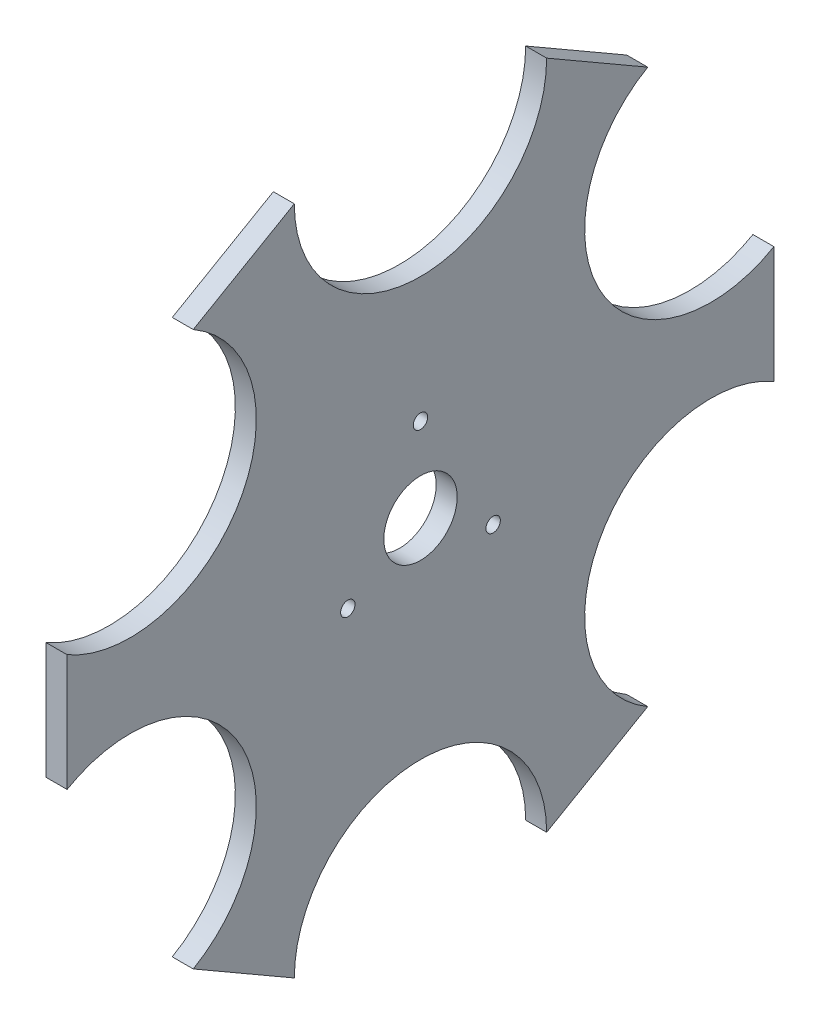
ISO-10303-21;
HEADER;
FILE_DESCRIPTION(('STEP AP214'),'2;1');
FILE_NAME('part.step','',(''),(''),'','','');
FILE_SCHEMA(('AUTOMOTIVE_DESIGN { 1 0 10303 214 1 1 1 1 }'));
ENDSEC;
DATA;
#1=APPLICATION_CONTEXT('core data for automotive mechanical design processes');
#2=APPLICATION_PROTOCOL_DEFINITION('international standard','automotive_design',2000,#1);
#3=PRODUCT_CONTEXT('',#1,'mechanical');
#4=PRODUCT('Part','Part','',(#3));
#5=PRODUCT_RELATED_PRODUCT_CATEGORY('part','',(#4));
#6=PRODUCT_DEFINITION_FORMATION('','',#4);
#7=PRODUCT_DEFINITION_CONTEXT('part definition',#1,'design');
#8=PRODUCT_DEFINITION('design','',#6,#7);
#9=PRODUCT_DEFINITION_SHAPE('','',#8);
#10=(LENGTH_UNIT() NAMED_UNIT(*) SI_UNIT(.MILLI.,.METRE.));
#11=(NAMED_UNIT(*) PLANE_ANGLE_UNIT() SI_UNIT($,.RADIAN.));
#12=(NAMED_UNIT(*) SI_UNIT($,.STERADIAN.) SOLID_ANGLE_UNIT());
#13=UNCERTAINTY_MEASURE_WITH_UNIT(LENGTH_MEASURE(1.E-05),#10,'distance_accuracy_value','');
#14=(GEOMETRIC_REPRESENTATION_CONTEXT(3) GLOBAL_UNCERTAINTY_ASSIGNED_CONTEXT((#13)) GLOBAL_UNIT_ASSIGNED_CONTEXT((#10,
#11,#12)) REPRESENTATION_CONTEXT('',''));
#15=CARTESIAN_POINT('',(0.,0.,0.));
#16=DIRECTION('',(0.,0.,1.));
#17=DIRECTION('',(1.,0.,0.));
#18=AXIS2_PLACEMENT_3D('',#15,#16,#17);
#19=CARTESIAN_POINT('',(6.35,101.5,0.));
#20=DIRECTION('',(1.,0.,0.));
#21=DIRECTION('',(0.,0.,-1.));
#22=AXIS2_PLACEMENT_3D('',#19,#20,#21);
#23=PLANE('',#22);
#24=CARTESIAN_POINT('',(6.35,-12.6999999999998,21.9970452561249));
#25=DIRECTION('',(1.,0.,0.));
#26=DIRECTION('',(0.,0.,-1.));
#27=AXIS2_PLACEMENT_3D('',#24,#25,#26);
#28=CIRCLE('',#27,2.182876);
#29=CARTESIAN_POINT('',(6.35,-12.6999999999998,19.8141692561249));
#30=VERTEX_POINT('',#29);
#31=EDGE_CURVE('E287',#30,#30,#28,.T.);
#32=ORIENTED_EDGE('',*,*,#31,.F.);
#33=EDGE_LOOP('',(#32));
#34=FACE_BOUND('',#33,.T.);
#35=CARTESIAN_POINT('',(6.35,-12.7000000000001,-21.9970452561247));
#36=DIRECTION('',(1.,0.,0.));
#37=DIRECTION('',(0.,0.,-1.));
#38=AXIS2_PLACEMENT_3D('',#35,#36,#37);
#39=CIRCLE('',#38,2.182876);
#40=CARTESIAN_POINT('',(6.35,-12.7000000000001,-24.1799212561247));
#41=VERTEX_POINT('',#40);
#42=EDGE_CURVE('E289',#41,#41,#39,.T.);
#43=ORIENTED_EDGE('',*,*,#42,.F.);
#44=EDGE_LOOP('',(#43));
#45=FACE_BOUND('',#44,.T.);
#46=CARTESIAN_POINT('',(6.35,25.4,0.));
#47=DIRECTION('',(1.,0.,0.));
#48=DIRECTION('',(0.,0.,-1.));
#49=AXIS2_PLACEMENT_3D('',#46,#47,#48);
#50=CIRCLE('',#49,2.182876);
#51=CARTESIAN_POINT('',(6.35,25.4,-2.182876));
#52=VERTEX_POINT('',#51);
#53=EDGE_CURVE('E297',#52,#52,#50,.T.);
#54=ORIENTED_EDGE('',*,*,#53,.F.);
#55=EDGE_LOOP('',(#54));
#56=FACE_BOUND('',#55,.T.);
#57=CARTESIAN_POINT('',(6.35,101.5,0.));
#58=DIRECTION('',(-1.,0.,0.));
#59=DIRECTION('',(0.,0.,-1.));
#60=AXIS2_PLACEMENT_3D('',#57,#58,#59);
#61=CIRCLE('',#60,38.200000054);
#62=CARTESIAN_POINT('',(6.35,101.5,-38.200000054));
#63=VERTEX_POINT('',#62);
#64=CARTESIAN_POINT('',(6.35,101.5,38.200000054));
#65=VERTEX_POINT('',#64);
#66=EDGE_CURVE('E179',#63,#65,#61,.T.);
#67=ORIENTED_EDGE('',*,*,#66,.T.);
#68=DIRECTION('',(0.,-0.5,0.866025403784438));
#69=VECTOR('',#68,1.);
#70=CARTESIAN_POINT('',(6.35,83.8321704713309,68.8015784571206));
#71=LINE('',#70,#69);
#72=CARTESIAN_POINT('',(6.35,83.8321704713308,68.8015784571206));
#73=VERTEX_POINT('',#72);
#74=EDGE_CURVE('E107',#65,#73,#71,.T.);
#75=ORIENTED_EDGE('',*,*,#74,.T.);
#76=CARTESIAN_POINT('',(6.35,50.7499999999999,87.9015784841206));
#77=DIRECTION('',(-1.,0.,0.));
#78=DIRECTION('',(0.,0.,-1.));
#79=AXIS2_PLACEMENT_3D('',#76,#77,#78);
#80=CIRCLE('',#79,38.200000054);
#81=CARTESIAN_POINT('',(6.35,17.667829528669,107.001578511121));
#82=VERTEX_POINT('',#81);
#83=EDGE_CURVE('E206',#73,#82,#80,.T.);
#84=ORIENTED_EDGE('',*,*,#83,.T.);
#85=DIRECTION('',(0.,-1.,0.));
#86=VECTOR('',#85,1.);
#87=CARTESIAN_POINT('',(6.35,-17.6678295286691,107.00157851112));
#88=LINE('',#87,#86);
#89=CARTESIAN_POINT('',(6.35,-17.6678295286691,107.001578511121));
#90=VERTEX_POINT('',#89);
#91=EDGE_CURVE('E225',#82,#90,#88,.T.);
#92=ORIENTED_EDGE('',*,*,#91,.T.);
#93=CARTESIAN_POINT('',(6.35,-50.75,87.9015784841205));
#94=DIRECTION('',(-1.,0.,0.));
#95=DIRECTION('',(0.,0.,-1.));
#96=AXIS2_PLACEMENT_3D('',#93,#94,#95);
#97=CIRCLE('',#96,38.200000054);
#98=CARTESIAN_POINT('',(6.35,-83.8321704713309,68.8015784571205));
#99=VERTEX_POINT('',#98);
#100=EDGE_CURVE('E222',#90,#99,#97,.T.);
#101=ORIENTED_EDGE('',*,*,#100,.T.);
#102=DIRECTION('',(0.,-0.5,-0.866025403784439));
#103=VECTOR('',#102,1.);
#104=CARTESIAN_POINT('',(6.35,-101.5,38.200000054));
#105=LINE('',#104,#103);
#106=CARTESIAN_POINT('',(6.35,-101.5,38.200000054));
#107=VERTEX_POINT('',#106);
#108=EDGE_CURVE('E224',#99,#107,#105,.T.);
#109=ORIENTED_EDGE('',*,*,#108,.T.);
#110=CARTESIAN_POINT('',(6.35,-101.5,0.));
#111=DIRECTION('',(-1.,0.,0.));
#112=DIRECTION('',(0.,0.,-1.));
#113=AXIS2_PLACEMENT_3D('',#110,#111,#112);
#114=CIRCLE('',#113,38.200000054);
#115=CARTESIAN_POINT('',(6.35,-101.5,-38.200000054));
#116=VERTEX_POINT('',#115);
#117=EDGE_CURVE('E227',#107,#116,#114,.T.);
#118=ORIENTED_EDGE('',*,*,#117,.T.);
#119=DIRECTION('',(0.,0.5,-0.866025403784438));
#120=VECTOR('',#119,1.);
#121=CARTESIAN_POINT('',(6.35,-83.8321704713309,-68.8015784571205));
#122=LINE('',#121,#120);
#123=CARTESIAN_POINT('',(6.35,-83.8321704713309,-68.8015784571205));
#124=VERTEX_POINT('',#123);
#125=EDGE_CURVE('E233',#116,#124,#122,.T.);
#126=ORIENTED_EDGE('',*,*,#125,.T.);
#127=CARTESIAN_POINT('',(6.35,-50.75,-87.9015784841205));
#128=DIRECTION('',(-1.,0.,0.));
#129=DIRECTION('',(0.,0.,-1.));
#130=AXIS2_PLACEMENT_3D('',#127,#128,#129);
#131=CIRCLE('',#130,38.200000054);
#132=CARTESIAN_POINT('',(6.35,-17.667829528669,-107.001578511121));
#133=VERTEX_POINT('',#132);
#134=EDGE_CURVE('E138',#124,#133,#131,.T.);
#135=ORIENTED_EDGE('',*,*,#134,.T.);
#136=DIRECTION('',(0.,1.,0.));
#137=VECTOR('',#136,1.);
#138=CARTESIAN_POINT('',(6.35,17.6678295286691,-107.001578511121));
#139=LINE('',#138,#137);
#140=CARTESIAN_POINT('',(6.35,17.6678295286692,-107.00157851112));
#141=VERTEX_POINT('',#140);
#142=EDGE_CURVE('E132',#133,#141,#139,.T.);
#143=ORIENTED_EDGE('',*,*,#142,.T.);
#144=CARTESIAN_POINT('',(6.35,50.75,-87.9015784841205));
#145=DIRECTION('',(-1.,0.,0.));
#146=DIRECTION('',(0.,0.,-1.));
#147=AXIS2_PLACEMENT_3D('',#144,#145,#146);
#148=CIRCLE('',#147,38.2000000539999);
#149=CARTESIAN_POINT('',(6.35,83.8321704713308,-68.8015784571207));
#150=VERTEX_POINT('',#149);
#151=EDGE_CURVE('E136',#141,#150,#148,.T.);
#152=ORIENTED_EDGE('',*,*,#151,.T.);
#153=DIRECTION('',(0.,0.500000000000001,0.866025403784438));
#154=VECTOR('',#153,1.);
#155=CARTESIAN_POINT('',(6.35,101.5,-38.200000054));
#156=LINE('',#155,#154);
#157=EDGE_CURVE('E52',#150,#63,#156,.T.);
#158=ORIENTED_EDGE('',*,*,#157,.T.);
#159=EDGE_LOOP('',(#67,#75,#84,#92,#101,#109,#118,#126,#135,#143,#152,#158));
#160=FACE_BOUND('',#159,.T.);
#161=CARTESIAN_POINT('',(6.35,0.,0.));
#162=DIRECTION('',(1.,0.,0.));
#163=DIRECTION('',(0.,0.,-1.));
#164=AXIS2_PLACEMENT_3D('',#161,#162,#163);
#165=CIRCLE('',#164,11.110595);
#166=CARTESIAN_POINT('',(6.35,0.,-11.110595));
#167=VERTEX_POINT('',#166);
#168=EDGE_CURVE('E160',#167,#167,#165,.T.);
#169=ORIENTED_EDGE('',*,*,#168,.F.);
#170=EDGE_LOOP('',(#169));
#171=FACE_BOUND('',#170,.T.);
#172=ADVANCED_FACE('F35',(#34,#45,#56,#160,#171),#23,.T.);
#173=CARTESIAN_POINT('',(0.,101.5,0.));
#174=DIRECTION('',(1.,0.,0.));
#175=DIRECTION('',(0.,0.,-1.));
#176=AXIS2_PLACEMENT_3D('',#173,#174,#175);
#177=PLANE('',#176);
#178=CARTESIAN_POINT('',(0.,-12.6999999999998,21.9970452561249));
#179=DIRECTION('',(1.,0.,0.));
#180=DIRECTION('',(0.,0.,-1.));
#181=AXIS2_PLACEMENT_3D('',#178,#179,#180);
#182=CIRCLE('',#181,2.182876);
#183=CARTESIAN_POINT('',(0.,-12.6999999999998,19.8141692561249));
#184=VERTEX_POINT('',#183);
#185=EDGE_CURVE('E285',#184,#184,#182,.T.);
#186=ORIENTED_EDGE('',*,*,#185,.T.);
#187=EDGE_LOOP('',(#186));
#188=FACE_BOUND('',#187,.T.);
#189=CARTESIAN_POINT('',(0.,-12.7000000000001,-21.9970452561247));
#190=DIRECTION('',(1.,0.,0.));
#191=DIRECTION('',(0.,0.,-1.));
#192=AXIS2_PLACEMENT_3D('',#189,#190,#191);
#193=CIRCLE('',#192,2.182876);
#194=CARTESIAN_POINT('',(0.,-12.7000000000001,-24.1799212561247));
#195=VERTEX_POINT('',#194);
#196=EDGE_CURVE('E294',#195,#195,#193,.T.);
#197=ORIENTED_EDGE('',*,*,#196,.T.);
#198=EDGE_LOOP('',(#197));
#199=FACE_BOUND('',#198,.T.);
#200=CARTESIAN_POINT('',(0.,25.4,0.));
#201=DIRECTION('',(1.,0.,0.));
#202=DIRECTION('',(0.,0.,-1.));
#203=AXIS2_PLACEMENT_3D('',#200,#201,#202);
#204=CIRCLE('',#203,2.182876);
#205=CARTESIAN_POINT('',(0.,25.4,-2.182876));
#206=VERTEX_POINT('',#205);
#207=EDGE_CURVE('E300',#206,#206,#204,.T.);
#208=ORIENTED_EDGE('',*,*,#207,.T.);
#209=EDGE_LOOP('',(#208));
#210=FACE_BOUND('',#209,.T.);
#211=CARTESIAN_POINT('',(0.,101.5,0.));
#212=DIRECTION('',(-1.,0.,0.));
#213=DIRECTION('',(0.,0.,-1.));
#214=AXIS2_PLACEMENT_3D('',#211,#212,#213);
#215=CIRCLE('',#214,38.200000054);
#216=CARTESIAN_POINT('',(0.,101.5,-38.200000054));
#217=VERTEX_POINT('',#216);
#218=CARTESIAN_POINT('',(0.,101.5,38.200000054));
#219=VERTEX_POINT('',#218);
#220=EDGE_CURVE('E156',#217,#219,#215,.T.);
#221=ORIENTED_EDGE('',*,*,#220,.F.);
#222=DIRECTION('',(0.,0.500000000000001,0.866025403784438));
#223=VECTOR('',#222,1.);
#224=CARTESIAN_POINT('',(0.,101.5,-38.200000054));
#225=LINE('',#224,#223);
#226=CARTESIAN_POINT('',(0.,83.8321704713308,-68.8015784571207));
#227=VERTEX_POINT('',#226);
#228=EDGE_CURVE('E99',#227,#217,#225,.T.);
#229=ORIENTED_EDGE('',*,*,#228,.F.);
#230=CARTESIAN_POINT('',(0.,50.75,-87.9015784841205));
#231=DIRECTION('',(-1.,0.,0.));
#232=DIRECTION('',(0.,0.,-1.));
#233=AXIS2_PLACEMENT_3D('',#230,#231,#232);
#234=CIRCLE('',#233,38.2000000539999);
#235=CARTESIAN_POINT('',(0.,17.6678295286692,-107.00157851112));
#236=VERTEX_POINT('',#235);
#237=EDGE_CURVE('E93',#236,#227,#234,.T.);
#238=ORIENTED_EDGE('',*,*,#237,.F.);
#239=DIRECTION('',(0.,1.,0.));
#240=VECTOR('',#239,1.);
#241=CARTESIAN_POINT('',(0.,17.6678295286691,-107.001578511121));
#242=LINE('',#241,#240);
#243=CARTESIAN_POINT('',(0.,-17.667829528669,-107.001578511121));
#244=VERTEX_POINT('',#243);
#245=EDGE_CURVE('E146',#244,#236,#242,.T.);
#246=ORIENTED_EDGE('',*,*,#245,.F.);
#247=CARTESIAN_POINT('',(0.,-50.75,-87.9015784841205));
#248=DIRECTION('',(-1.,0.,0.));
#249=DIRECTION('',(0.,0.,-1.));
#250=AXIS2_PLACEMENT_3D('',#247,#248,#249);
#251=CIRCLE('',#250,38.200000054);
#252=CARTESIAN_POINT('',(0.,-83.8321704713309,-68.8015784571205));
#253=VERTEX_POINT('',#252);
#254=EDGE_CURVE('E174',#253,#244,#251,.T.);
#255=ORIENTED_EDGE('',*,*,#254,.F.);
#256=DIRECTION('',(0.,0.5,-0.866025403784438));
#257=VECTOR('',#256,1.);
#258=CARTESIAN_POINT('',(0.,-83.8321704713309,-68.8015784571205));
#259=LINE('',#258,#257);
#260=CARTESIAN_POINT('',(0.,-101.5,-38.200000054));
#261=VERTEX_POINT('',#260);
#262=EDGE_CURVE('E172',#261,#253,#259,.T.);
#263=ORIENTED_EDGE('',*,*,#262,.F.);
#264=CARTESIAN_POINT('',(0.,-101.5,0.));
#265=DIRECTION('',(-1.,0.,0.));
#266=DIRECTION('',(0.,0.,-1.));
#267=AXIS2_PLACEMENT_3D('',#264,#265,#266);
#268=CIRCLE('',#267,38.200000054);
#269=CARTESIAN_POINT('',(0.,-101.5,38.200000054));
#270=VERTEX_POINT('',#269);
#271=EDGE_CURVE('E170',#270,#261,#268,.T.);
#272=ORIENTED_EDGE('',*,*,#271,.F.);
#273=DIRECTION('',(0.,-0.5,-0.866025403784439));
#274=VECTOR('',#273,1.);
#275=CARTESIAN_POINT('',(0.,-101.5,38.200000054));
#276=LINE('',#275,#274);
#277=CARTESIAN_POINT('',(0.,-83.8321704713309,68.8015784571205));
#278=VERTEX_POINT('',#277);
#279=EDGE_CURVE('E168',#278,#270,#276,.T.);
#280=ORIENTED_EDGE('',*,*,#279,.F.);
#281=CARTESIAN_POINT('',(0.,-50.75,87.9015784841205));
#282=DIRECTION('',(-1.,0.,0.));
#283=DIRECTION('',(0.,0.,-1.));
#284=AXIS2_PLACEMENT_3D('',#281,#282,#283);
#285=CIRCLE('',#284,38.200000054);
#286=CARTESIAN_POINT('',(0.,-17.6678295286691,107.001578511121));
#287=VERTEX_POINT('',#286);
#288=EDGE_CURVE('E166',#287,#278,#285,.T.);
#289=ORIENTED_EDGE('',*,*,#288,.F.);
#290=DIRECTION('',(0.,-1.,0.));
#291=VECTOR('',#290,1.);
#292=CARTESIAN_POINT('',(0.,-17.6678295286691,107.00157851112));
#293=LINE('',#292,#291);
#294=CARTESIAN_POINT('',(0.,17.667829528669,107.001578511121));
#295=VERTEX_POINT('',#294);
#296=EDGE_CURVE('E164',#295,#287,#293,.T.);
#297=ORIENTED_EDGE('',*,*,#296,.F.);
#298=CARTESIAN_POINT('',(0.,50.7499999999999,87.9015784841206));
#299=DIRECTION('',(-1.,0.,0.));
#300=DIRECTION('',(0.,0.,-1.));
#301=AXIS2_PLACEMENT_3D('',#298,#299,#300);
#302=CIRCLE('',#301,38.200000054);
#303=CARTESIAN_POINT('',(0.,83.8321704713308,68.8015784571206));
#304=VERTEX_POINT('',#303);
#305=EDGE_CURVE('E162',#304,#295,#302,.T.);
#306=ORIENTED_EDGE('',*,*,#305,.F.);
#307=DIRECTION('',(0.,-0.5,0.866025403784438));
#308=VECTOR('',#307,1.);
#309=CARTESIAN_POINT('',(0.,83.8321704713309,68.8015784571206));
#310=LINE('',#309,#308);
#311=EDGE_CURVE('E159',#219,#304,#310,.T.);
#312=ORIENTED_EDGE('',*,*,#311,.F.);
#313=EDGE_LOOP('',(#221,#229,#238,#246,#255,#263,#272,#280,#289,#297,#306,#312));
#314=FACE_BOUND('',#313,.T.);
#315=CARTESIAN_POINT('',(0.,0.,0.));
#316=DIRECTION('',(1.,0.,0.));
#317=DIRECTION('',(0.,0.,-1.));
#318=AXIS2_PLACEMENT_3D('',#315,#316,#317);
#319=CIRCLE('',#318,11.110595);
#320=CARTESIAN_POINT('',(0.,0.,-11.110595));
#321=VERTEX_POINT('',#320);
#322=EDGE_CURVE('E303',#321,#321,#319,.T.);
#323=ORIENTED_EDGE('',*,*,#322,.T.);
#324=EDGE_LOOP('',(#323));
#325=FACE_BOUND('',#324,.T.);
#326=ADVANCED_FACE('F210',(#188,#199,#210,#314,#325),#177,.F.);
#327=CARTESIAN_POINT('',(6.35,101.5,0.));
#328=DIRECTION('',(-1.,0.,0.));
#329=DIRECTION('',(0.,0.,1.));
#330=AXIS2_PLACEMENT_3D('',#327,#328,#329);
#331=CYLINDRICAL_SURFACE('',#330,38.200000054);
#332=ORIENTED_EDGE('',*,*,#220,.T.);
#333=DIRECTION('',(-1.,0.,0.));
#334=VECTOR('',#333,1.);
#335=CARTESIAN_POINT('',(6.35,101.5,38.200000054));
#336=LINE('',#335,#334);
#337=EDGE_CURVE('E11',#65,#219,#336,.T.);
#338=ORIENTED_EDGE('',*,*,#337,.F.);
#339=ORIENTED_EDGE('',*,*,#66,.F.);
#340=DIRECTION('',(-1.,0.,0.));
#341=VECTOR('',#340,1.);
#342=CARTESIAN_POINT('',(6.35,101.5,-38.200000054));
#343=LINE('',#342,#341);
#344=EDGE_CURVE('E152',#63,#217,#343,.T.);
#345=ORIENTED_EDGE('',*,*,#344,.T.);
#346=EDGE_LOOP('',(#332,#338,#339,#345));
#347=FACE_BOUND('',#346,.T.);
#348=ADVANCED_FACE('F37',(#347),#331,.F.);
#349=CARTESIAN_POINT('',(6.35,83.8321704713309,68.8015784571206));
#350=DIRECTION('',(0.,-0.866025403784438,-0.5));
#351=DIRECTION('',(0.,0.500000000000001,-0.866025403784438));
#352=AXIS2_PLACEMENT_3D('',#349,#350,#351);
#353=PLANE('',#352);
#354=ORIENTED_EDGE('',*,*,#311,.T.);
#355=DIRECTION('',(-1.,0.,0.));
#356=VECTOR('',#355,1.);
#357=CARTESIAN_POINT('',(6.35,83.8321704713308,68.8015784571206));
#358=LINE('',#357,#356);
#359=EDGE_CURVE('E44',#73,#304,#358,.T.);
#360=ORIENTED_EDGE('',*,*,#359,.F.);
#361=ORIENTED_EDGE('',*,*,#74,.F.);
#362=ORIENTED_EDGE('',*,*,#337,.T.);
#363=EDGE_LOOP('',(#354,#360,#361,#362));
#364=FACE_BOUND('',#363,.T.);
#365=ADVANCED_FACE('F413',(#364),#353,.F.);
#366=CARTESIAN_POINT('',(6.35,50.7499999999999,87.9015784841206));
#367=DIRECTION('',(-1.,0.,0.));
#368=DIRECTION('',(0.,0.,1.));
#369=AXIS2_PLACEMENT_3D('',#366,#367,#368);
#370=CYLINDRICAL_SURFACE('',#369,38.200000054);
#371=ORIENTED_EDGE('',*,*,#305,.T.);
#372=DIRECTION('',(-1.,0.,0.));
#373=VECTOR('',#372,1.);
#374=CARTESIAN_POINT('',(6.35,17.667829528669,107.001578511121));
#375=LINE('',#374,#373);
#376=EDGE_CURVE('E198',#82,#295,#375,.T.);
#377=ORIENTED_EDGE('',*,*,#376,.F.);
#378=ORIENTED_EDGE('',*,*,#83,.F.);
#379=ORIENTED_EDGE('',*,*,#359,.T.);
#380=EDGE_LOOP('',(#371,#377,#378,#379));
#381=FACE_BOUND('',#380,.T.);
#382=ADVANCED_FACE('F204',(#381),#370,.F.);
#383=CARTESIAN_POINT('',(6.35,-17.6678295286691,107.00157851112));
#384=DIRECTION('',(0.,0.,-1.));
#385=DIRECTION('',(0.,1.,0.));
#386=AXIS2_PLACEMENT_3D('',#383,#384,#385);
#387=PLANE('',#386);
#388=ORIENTED_EDGE('',*,*,#296,.T.);
#389=DIRECTION('',(-1.,0.,0.));
#390=VECTOR('',#389,1.);
#391=CARTESIAN_POINT('',(6.35,-17.6678295286691,107.001578511121));
#392=LINE('',#391,#390);
#393=EDGE_CURVE('E195',#90,#287,#392,.T.);
#394=ORIENTED_EDGE('',*,*,#393,.F.);
#395=ORIENTED_EDGE('',*,*,#91,.F.);
#396=ORIENTED_EDGE('',*,*,#376,.T.);
#397=EDGE_LOOP('',(#388,#394,#395,#396));
#398=FACE_BOUND('',#397,.T.);
#399=ADVANCED_FACE('F216',(#398),#387,.F.);
#400=CARTESIAN_POINT('',(6.35,-50.75,87.9015784841205));
#401=DIRECTION('',(-1.,0.,0.));
#402=DIRECTION('',(0.,0.,1.));
#403=AXIS2_PLACEMENT_3D('',#400,#401,#402);
#404=CYLINDRICAL_SURFACE('',#403,38.200000054);
#405=ORIENTED_EDGE('',*,*,#288,.T.);
#406=DIRECTION('',(-1.,0.,0.));
#407=VECTOR('',#406,1.);
#408=CARTESIAN_POINT('',(6.35,-83.8321704713309,68.8015784571205));
#409=LINE('',#408,#407);
#410=EDGE_CURVE('E192',#99,#278,#409,.T.);
#411=ORIENTED_EDGE('',*,*,#410,.F.);
#412=ORIENTED_EDGE('',*,*,#100,.F.);
#413=ORIENTED_EDGE('',*,*,#393,.T.);
#414=EDGE_LOOP('',(#405,#411,#412,#413));
#415=FACE_BOUND('',#414,.T.);
#416=ADVANCED_FACE('F220',(#415),#404,.F.);
#417=CARTESIAN_POINT('',(6.35,-101.5,38.200000054));
#418=DIRECTION('',(0.,0.866025403784439,-0.5));
#419=DIRECTION('',(0.,0.5,0.866025403784439));
#420=AXIS2_PLACEMENT_3D('',#417,#418,#419);
#421=PLANE('',#420);
#422=ORIENTED_EDGE('',*,*,#279,.T.);
#423=DIRECTION('',(-1.,0.,0.));
#424=VECTOR('',#423,1.);
#425=CARTESIAN_POINT('',(6.35,-101.5,38.200000054));
#426=LINE('',#425,#424);
#427=EDGE_CURVE('E189',#107,#270,#426,.T.);
#428=ORIENTED_EDGE('',*,*,#427,.F.);
#429=ORIENTED_EDGE('',*,*,#108,.F.);
#430=ORIENTED_EDGE('',*,*,#410,.T.);
#431=EDGE_LOOP('',(#422,#428,#429,#430));
#432=FACE_BOUND('',#431,.T.);
#433=ADVANCED_FACE('F378',(#432),#421,.F.);
#434=CARTESIAN_POINT('',(6.35,-101.5,0.));
#435=DIRECTION('',(-1.,0.,0.));
#436=DIRECTION('',(0.,0.,1.));
#437=AXIS2_PLACEMENT_3D('',#434,#435,#436);
#438=CYLINDRICAL_SURFACE('',#437,38.200000054);
#439=ORIENTED_EDGE('',*,*,#271,.T.);
#440=DIRECTION('',(-1.,0.,0.));
#441=VECTOR('',#440,1.);
#442=CARTESIAN_POINT('',(6.35,-101.5,-38.200000054));
#443=LINE('',#442,#441);
#444=EDGE_CURVE('E186',#116,#261,#443,.T.);
#445=ORIENTED_EDGE('',*,*,#444,.F.);
#446=ORIENTED_EDGE('',*,*,#117,.F.);
#447=ORIENTED_EDGE('',*,*,#427,.T.);
#448=EDGE_LOOP('',(#439,#445,#446,#447));
#449=FACE_BOUND('',#448,.T.);
#450=ADVANCED_FACE('F369',(#449),#438,.F.);
#451=CARTESIAN_POINT('',(6.35,-83.8321704713309,-68.8015784571205));
#452=DIRECTION('',(0.,0.866025403784438,0.5));
#453=DIRECTION('',(0.,-0.500000000000001,0.866025403784438));
#454=AXIS2_PLACEMENT_3D('',#451,#452,#453);
#455=PLANE('',#454);
#456=ORIENTED_EDGE('',*,*,#262,.T.);
#457=DIRECTION('',(-1.,0.,0.));
#458=VECTOR('',#457,1.);
#459=CARTESIAN_POINT('',(6.35,-83.8321704713309,-68.8015784571205));
#460=LINE('',#459,#458);
#461=EDGE_CURVE('E183',#124,#253,#460,.T.);
#462=ORIENTED_EDGE('',*,*,#461,.F.);
#463=ORIENTED_EDGE('',*,*,#125,.F.);
#464=ORIENTED_EDGE('',*,*,#444,.T.);
#465=EDGE_LOOP('',(#456,#462,#463,#464));
#466=FACE_BOUND('',#465,.T.);
#467=ADVANCED_FACE('F239',(#466),#455,.F.);
#468=CARTESIAN_POINT('',(6.35,-50.75,-87.9015784841205));
#469=DIRECTION('',(-1.,0.,0.));
#470=DIRECTION('',(0.,0.,1.));
#471=AXIS2_PLACEMENT_3D('',#468,#469,#470);
#472=CYLINDRICAL_SURFACE('',#471,38.200000054);
#473=ORIENTED_EDGE('',*,*,#254,.T.);
#474=DIRECTION('',(-1.,0.,0.));
#475=VECTOR('',#474,1.);
#476=CARTESIAN_POINT('',(6.35,-17.667829528669,-107.001578511121));
#477=LINE('',#476,#475);
#478=EDGE_CURVE('E147',#133,#244,#477,.T.);
#479=ORIENTED_EDGE('',*,*,#478,.F.);
#480=ORIENTED_EDGE('',*,*,#134,.F.);
#481=ORIENTED_EDGE('',*,*,#461,.T.);
#482=EDGE_LOOP('',(#473,#479,#480,#481));
#483=FACE_BOUND('',#482,.T.);
#484=ADVANCED_FACE('F243',(#483),#472,.F.);
#485=CARTESIAN_POINT('',(6.35,17.6678295286691,-107.001578511121));
#486=DIRECTION('',(0.,0.,1.));
#487=DIRECTION('',(1.,0.,0.));
#488=AXIS2_PLACEMENT_3D('',#485,#486,#487);
#489=PLANE('',#488);
#490=ORIENTED_EDGE('',*,*,#245,.T.);
#491=DIRECTION('',(-1.,0.,0.));
#492=VECTOR('',#491,1.);
#493=CARTESIAN_POINT('',(6.35,17.6678295286692,-107.00157851112));
#494=LINE('',#493,#492);
#495=EDGE_CURVE('E143',#141,#236,#494,.T.);
#496=ORIENTED_EDGE('',*,*,#495,.F.);
#497=ORIENTED_EDGE('',*,*,#142,.F.);
#498=ORIENTED_EDGE('',*,*,#478,.T.);
#499=EDGE_LOOP('',(#490,#496,#497,#498));
#500=FACE_BOUND('',#499,.T.);
#501=ADVANCED_FACE('F144',(#500),#489,.F.);
#502=CARTESIAN_POINT('',(6.35,50.75,-87.9015784841205));
#503=DIRECTION('',(-1.,0.,0.));
#504=DIRECTION('',(0.,0.,1.));
#505=AXIS2_PLACEMENT_3D('',#502,#503,#504);
#506=CYLINDRICAL_SURFACE('',#505,38.2000000539999);
#507=ORIENTED_EDGE('',*,*,#237,.T.);
#508=DIRECTION('',(-1.,0.,0.));
#509=VECTOR('',#508,1.);
#510=CARTESIAN_POINT('',(6.35,83.8321704713308,-68.8015784571207));
#511=LINE('',#510,#509);
#512=EDGE_CURVE('E148',#150,#227,#511,.T.);
#513=ORIENTED_EDGE('',*,*,#512,.F.);
#514=ORIENTED_EDGE('',*,*,#151,.F.);
#515=ORIENTED_EDGE('',*,*,#495,.T.);
#516=EDGE_LOOP('',(#507,#513,#514,#515));
#517=FACE_BOUND('',#516,.T.);
#518=ADVANCED_FACE('F150',(#517),#506,.F.);
#519=CARTESIAN_POINT('',(6.35,101.5,-38.200000054));
#520=DIRECTION('',(0.,-0.866025403784438,0.500000000000001));
#521=DIRECTION('',(0.,-0.500000000000001,-0.866025403784438));
#522=AXIS2_PLACEMENT_3D('',#519,#520,#521);
#523=PLANE('',#522);
#524=ORIENTED_EDGE('',*,*,#228,.T.);
#525=ORIENTED_EDGE('',*,*,#344,.F.);
#526=ORIENTED_EDGE('',*,*,#157,.F.);
#527=ORIENTED_EDGE('',*,*,#512,.T.);
#528=EDGE_LOOP('',(#524,#525,#526,#527));
#529=FACE_BOUND('',#528,.T.);
#530=ADVANCED_FACE('F247',(#529),#523,.F.);
#531=CARTESIAN_POINT('',(6.35,0.,0.));
#532=DIRECTION('',(-1.,0.,0.));
#533=DIRECTION('',(0.,0.,1.));
#534=AXIS2_PLACEMENT_3D('',#531,#532,#533);
#535=CYLINDRICAL_SURFACE('',#534,11.110595);
#536=ORIENTED_EDGE('',*,*,#168,.T.);
#537=EDGE_LOOP('',(#536));
#538=FACE_BOUND('',#537,.T.);
#539=ORIENTED_EDGE('',*,*,#322,.F.);
#540=EDGE_LOOP('',(#539));
#541=FACE_BOUND('',#540,.T.);
#542=ADVANCED_FACE('F249',(#538,#541),#535,.F.);
#543=CARTESIAN_POINT('',(6.35,25.4,0.));
#544=DIRECTION('',(1.,0.,0.));
#545=DIRECTION('',(0.,0.,-1.));
#546=AXIS2_PLACEMENT_3D('',#543,#544,#545);
#547=CYLINDRICAL_SURFACE('',#546,2.182876);
#548=ORIENTED_EDGE('',*,*,#207,.F.);
#549=EDGE_LOOP('',(#548));
#550=FACE_BOUND('',#549,.T.);
#551=ORIENTED_EDGE('',*,*,#53,.T.);
#552=EDGE_LOOP('',(#551));
#553=FACE_BOUND('',#552,.T.);
#554=ADVANCED_FACE('F255',(#550,#553),#547,.F.);
#555=CARTESIAN_POINT('',(6.35,-12.7000000000001,-21.9970452561247));
#556=DIRECTION('',(1.,0.,0.));
#557=DIRECTION('',(0.,0.,-1.));
#558=AXIS2_PLACEMENT_3D('',#555,#556,#557);
#559=CYLINDRICAL_SURFACE('',#558,2.182876);
#560=ORIENTED_EDGE('',*,*,#196,.F.);
#561=EDGE_LOOP('',(#560));
#562=FACE_BOUND('',#561,.T.);
#563=ORIENTED_EDGE('',*,*,#42,.T.);
#564=EDGE_LOOP('',(#563));
#565=FACE_BOUND('',#564,.T.);
#566=ADVANCED_FACE('F272',(#562,#565),#559,.F.);
#567=CARTESIAN_POINT('',(6.35,-12.6999999999998,21.9970452561249));
#568=DIRECTION('',(1.,0.,0.));
#569=DIRECTION('',(0.,0.,-1.));
#570=AXIS2_PLACEMENT_3D('',#567,#568,#569);
#571=CYLINDRICAL_SURFACE('',#570,2.182876);
#572=ORIENTED_EDGE('',*,*,#185,.F.);
#573=EDGE_LOOP('',(#572));
#574=FACE_BOUND('',#573,.T.);
#575=ORIENTED_EDGE('',*,*,#31,.T.);
#576=EDGE_LOOP('',(#575));
#577=FACE_BOUND('',#576,.T.);
#578=ADVANCED_FACE('F276',(#574,#577),#571,.F.);
#579=CLOSED_SHELL('',(#172,#326,#348,#365,#382,#399,#416,#433,#450,#467,#484,#501,#518,#530,
#542,#554,#566,#578));
#580=MANIFOLD_SOLID_BREP('B2',#579);
#581=ADVANCED_BREP_SHAPE_REPRESENTATION('',(#18,#580),#14);
#582=SHAPE_DEFINITION_REPRESENTATION(#9,#581);
ENDSEC;
END-ISO-10303-21;
